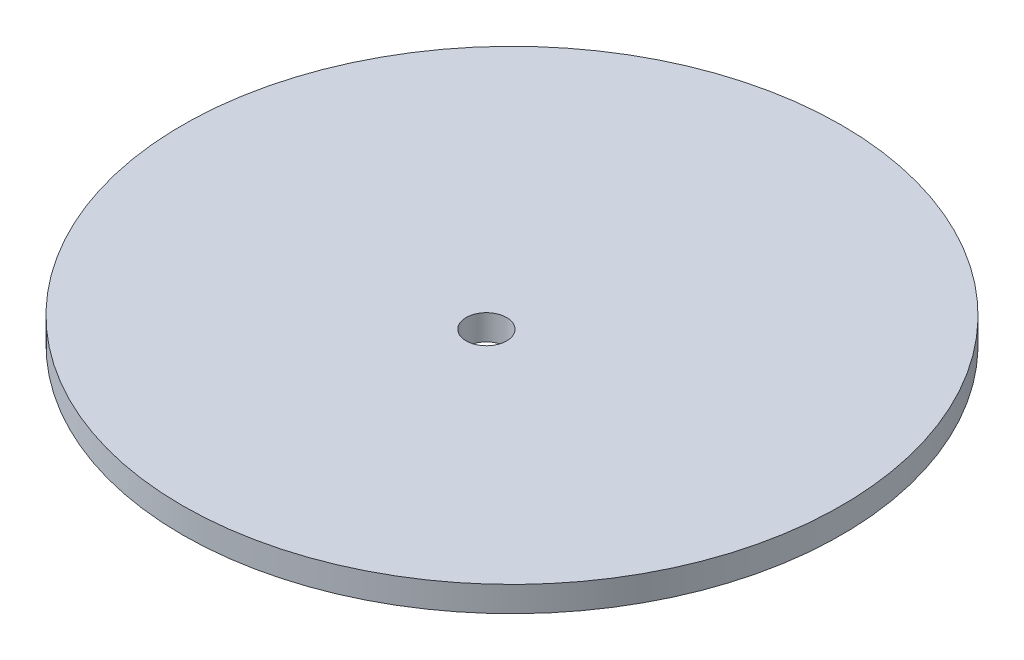
ISO-10303-21;
HEADER;
FILE_DESCRIPTION(('STEP AP214'),'2;1');
FILE_NAME('part.step','',(''),(''),'','','');
FILE_SCHEMA(('AUTOMOTIVE_DESIGN { 1 0 10303 214 1 1 1 1 }'));
ENDSEC;
DATA;
#1=APPLICATION_CONTEXT('core data for automotive mechanical design processes');
#2=APPLICATION_PROTOCOL_DEFINITION('international standard','automotive_design',2000,#1);
#3=PRODUCT_CONTEXT('',#1,'mechanical');
#4=PRODUCT('Part','Part','',(#3));
#5=PRODUCT_RELATED_PRODUCT_CATEGORY('part','',(#4));
#6=PRODUCT_DEFINITION_FORMATION('','',#4);
#7=PRODUCT_DEFINITION_CONTEXT('part definition',#1,'design');
#8=PRODUCT_DEFINITION('design','',#6,#7);
#9=PRODUCT_DEFINITION_SHAPE('','',#8);
#10=(LENGTH_UNIT() NAMED_UNIT(*) SI_UNIT(.MILLI.,.METRE.));
#11=(NAMED_UNIT(*) PLANE_ANGLE_UNIT() SI_UNIT($,.RADIAN.));
#12=(NAMED_UNIT(*) SI_UNIT($,.STERADIAN.) SOLID_ANGLE_UNIT());
#13=UNCERTAINTY_MEASURE_WITH_UNIT(LENGTH_MEASURE(1.E-05),#10,'distance_accuracy_value','');
#14=(GEOMETRIC_REPRESENTATION_CONTEXT(3) GLOBAL_UNCERTAINTY_ASSIGNED_CONTEXT((#13)) GLOBAL_UNIT_ASSIGNED_CONTEXT((#10,
#11,#12)) REPRESENTATION_CONTEXT('',''));
#15=CARTESIAN_POINT('',(0.,0.,0.));
#16=DIRECTION('',(0.,0.,1.));
#17=DIRECTION('',(1.,0.,0.));
#18=AXIS2_PLACEMENT_3D('',#15,#16,#17);
#19=CARTESIAN_POINT('',(0.,5.,0.));
#20=DIRECTION('',(0.,-1.,0.));
#21=DIRECTION('',(0.,0.,-1.));
#22=AXIS2_PLACEMENT_3D('',#19,#20,#21);
#23=CYLINDRICAL_SURFACE('',#22,65.);
#24=CARTESIAN_POINT('',(0.,5.,0.));
#25=DIRECTION('',(0.,1.,0.));
#26=DIRECTION('',(0.,0.,1.));
#27=AXIS2_PLACEMENT_3D('',#24,#25,#26);
#28=CIRCLE('',#27,65.);
#29=CARTESIAN_POINT('',(0.,5.,65.));
#30=VERTEX_POINT('',#29);
#31=EDGE_CURVE('E10',#30,#30,#28,.T.);
#32=ORIENTED_EDGE('',*,*,#31,.F.);
#33=EDGE_LOOP('',(#32));
#34=FACE_BOUND('',#33,.T.);
#35=CARTESIAN_POINT('',(0.,0.,0.));
#36=DIRECTION('',(0.,1.,0.));
#37=DIRECTION('',(0.,0.,1.));
#38=AXIS2_PLACEMENT_3D('',#35,#36,#37);
#39=CIRCLE('',#38,65.);
#40=CARTESIAN_POINT('',(0.,0.,65.));
#41=VERTEX_POINT('',#40);
#42=EDGE_CURVE('E46',#41,#41,#39,.T.);
#43=ORIENTED_EDGE('',*,*,#42,.T.);
#44=EDGE_LOOP('',(#43));
#45=FACE_BOUND('',#44,.T.);
#46=ADVANCED_FACE('F43',(#34,#45),#23,.T.);
#47=CARTESIAN_POINT('',(0.,5.,0.));
#48=DIRECTION('',(0.,1.,0.));
#49=DIRECTION('',(0.,0.,1.));
#50=AXIS2_PLACEMENT_3D('',#47,#48,#49);
#51=PLANE('',#50);
#52=CARTESIAN_POINT('',(-0.157021516884015,5.,4.89072543780367));
#53=DIRECTION('',(0.,-1.,0.));
#54=DIRECTION('',(0.,0.,-1.));
#55=AXIS2_PLACEMENT_3D('',#52,#53,#54);
#56=CIRCLE('',#55,4.);
#57=CARTESIAN_POINT('',(-0.157021516884015,5.,0.890725437803667));
#58=VERTEX_POINT('',#57);
#59=EDGE_CURVE('E54',#58,#58,#56,.T.);
#60=ORIENTED_EDGE('',*,*,#59,.T.);
#61=EDGE_LOOP('',(#60));
#62=FACE_BOUND('',#61,.T.);
#63=ORIENTED_EDGE('',*,*,#31,.T.);
#64=EDGE_LOOP('',(#63));
#65=FACE_BOUND('',#64,.T.);
#66=ADVANCED_FACE('F64',(#62,#65),#51,.T.);
#67=CARTESIAN_POINT('',(0.,0.,0.));
#68=DIRECTION('',(0.,1.,0.));
#69=DIRECTION('',(0.,0.,1.));
#70=AXIS2_PLACEMENT_3D('',#67,#68,#69);
#71=PLANE('',#70);
#72=CARTESIAN_POINT('',(-0.157021516884015,0.,4.89072543780367));
#73=DIRECTION('',(0.,-1.,0.));
#74=DIRECTION('',(0.,0.,-1.));
#75=AXIS2_PLACEMENT_3D('',#72,#73,#74);
#76=CIRCLE('',#75,4.);
#77=CARTESIAN_POINT('',(-0.157021516884015,0.,0.890725437803667));
#78=VERTEX_POINT('',#77);
#79=EDGE_CURVE('E60',#78,#78,#76,.T.);
#80=ORIENTED_EDGE('',*,*,#79,.F.);
#81=EDGE_LOOP('',(#80));
#82=FACE_BOUND('',#81,.T.);
#83=ORIENTED_EDGE('',*,*,#42,.F.);
#84=EDGE_LOOP('',(#83));
#85=FACE_BOUND('',#84,.T.);
#86=ADVANCED_FACE('F68',(#82,#85),#71,.F.);
#87=CARTESIAN_POINT('',(-0.157021516884015,5.,4.89072543780367));
#88=DIRECTION('',(0.,-1.,0.));
#89=DIRECTION('',(0.,0.,-1.));
#90=AXIS2_PLACEMENT_3D('',#87,#88,#89);
#91=CYLINDRICAL_SURFACE('',#90,4.);
#92=ORIENTED_EDGE('',*,*,#59,.F.);
#93=EDGE_LOOP('',(#92));
#94=FACE_BOUND('',#93,.T.);
#95=ORIENTED_EDGE('',*,*,#79,.T.);
#96=EDGE_LOOP('',(#95));
#97=FACE_BOUND('',#96,.T.);
#98=ADVANCED_FACE('F70',(#94,#97),#91,.F.);
#99=CLOSED_SHELL('',(#46,#66,#86,#98));
#100=MANIFOLD_SOLID_BREP('B2',#99);
#101=ADVANCED_BREP_SHAPE_REPRESENTATION('',(#18,#100),#14);
#102=SHAPE_DEFINITION_REPRESENTATION(#9,#101);
ENDSEC;
END-ISO-10303-21;
